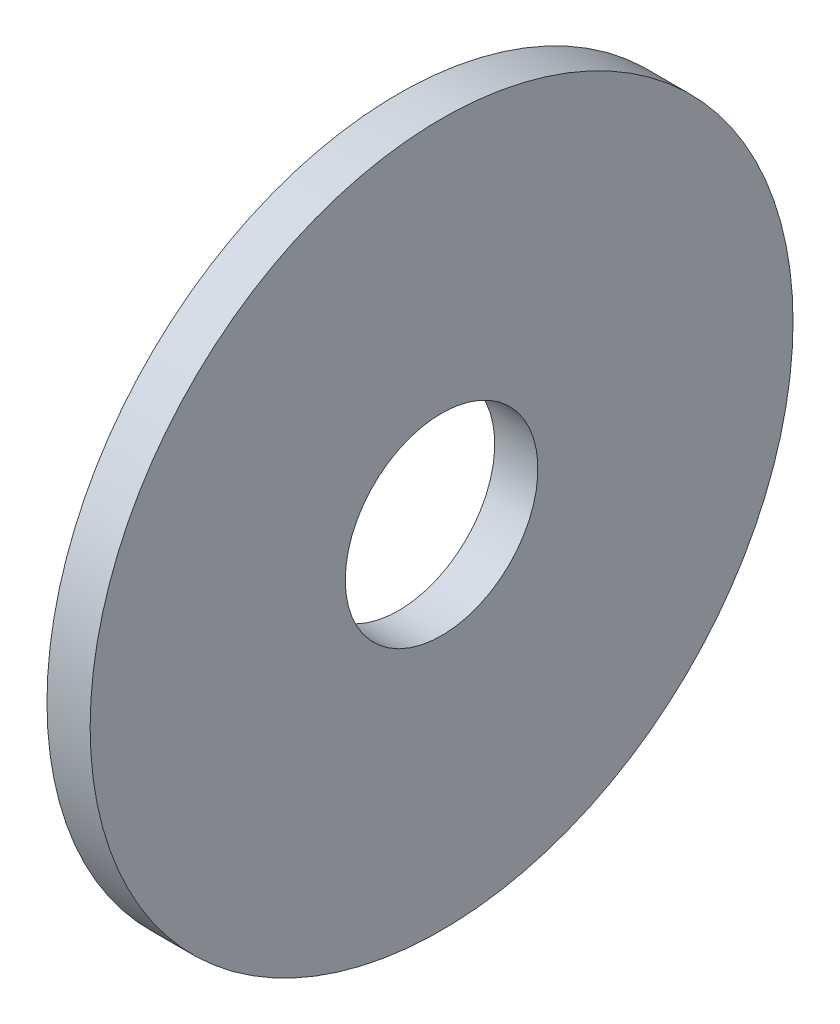
ISO-10303-21;
HEADER;
FILE_DESCRIPTION(('STEP AP214'),'2;1');
FILE_NAME('part.step','',(''),(''),'','','');
FILE_SCHEMA(('AUTOMOTIVE_DESIGN { 1 0 10303 214 1 1 1 1 }'));
ENDSEC;
DATA;
#1=APPLICATION_CONTEXT('core data for automotive mechanical design processes');
#2=APPLICATION_PROTOCOL_DEFINITION('international standard','automotive_design',2000,#1);
#3=PRODUCT_CONTEXT('',#1,'mechanical');
#4=PRODUCT('Part','Part','',(#3));
#5=PRODUCT_RELATED_PRODUCT_CATEGORY('part','',(#4));
#6=PRODUCT_DEFINITION_FORMATION('','',#4);
#7=PRODUCT_DEFINITION_CONTEXT('part definition',#1,'design');
#8=PRODUCT_DEFINITION('design','',#6,#7);
#9=PRODUCT_DEFINITION_SHAPE('','',#8);
#10=(LENGTH_UNIT() NAMED_UNIT(*) SI_UNIT(.MILLI.,.METRE.));
#11=(NAMED_UNIT(*) PLANE_ANGLE_UNIT() SI_UNIT($,.RADIAN.));
#12=(NAMED_UNIT(*) SI_UNIT($,.STERADIAN.) SOLID_ANGLE_UNIT());
#13=UNCERTAINTY_MEASURE_WITH_UNIT(LENGTH_MEASURE(1.E-05),#10,'distance_accuracy_value','');
#14=(GEOMETRIC_REPRESENTATION_CONTEXT(3) GLOBAL_UNCERTAINTY_ASSIGNED_CONTEXT((#13)) GLOBAL_UNIT_ASSIGNED_CONTEXT((#10,
#11,#12)) REPRESENTATION_CONTEXT('',''));
#15=CARTESIAN_POINT('',(0.,0.,0.));
#16=DIRECTION('',(0.,0.,1.));
#17=DIRECTION('',(1.,0.,0.));
#18=AXIS2_PLACEMENT_3D('',#15,#16,#17);
#19=CARTESIAN_POINT('',(-34.9249999999999,0.,0.));
#20=DIRECTION('',(-1.,0.,0.));
#21=DIRECTION('',(0.,0.,1.));
#22=AXIS2_PLACEMENT_3D('',#19,#20,#21);
#23=CYLINDRICAL_SURFACE('',#22,13.4874);
#24=CARTESIAN_POINT('',(0.,0.,0.));
#25=DIRECTION('',(-1.,0.,0.));
#26=DIRECTION('',(0.,0.,1.));
#27=AXIS2_PLACEMENT_3D('',#24,#25,#26);
#28=CIRCLE('',#27,13.4874);
#29=CARTESIAN_POINT('',(0.,0.,13.4874));
#30=VERTEX_POINT('',#29);
#31=EDGE_CURVE('E10',#30,#30,#28,.T.);
#32=ORIENTED_EDGE('',*,*,#31,.F.);
#33=EDGE_LOOP('',(#32));
#34=FACE_BOUND('',#33,.T.);
#35=CARTESIAN_POINT('',(-6.0452,0.,0.));
#36=DIRECTION('',(-1.,0.,0.));
#37=DIRECTION('',(0.,0.,1.));
#38=AXIS2_PLACEMENT_3D('',#35,#36,#37);
#39=CIRCLE('',#38,13.4874);
#40=CARTESIAN_POINT('',(-6.0452,0.,13.4874));
#41=VERTEX_POINT('',#40);
#42=EDGE_CURVE('E44',#41,#41,#39,.T.);
#43=ORIENTED_EDGE('',*,*,#42,.T.);
#44=EDGE_LOOP('',(#43));
#45=FACE_BOUND('',#44,.T.);
#46=ADVANCED_FACE('F30',(#34,#45),#23,.F.);
#47=CARTESIAN_POINT('',(0.,13.4874,0.));
#48=DIRECTION('',(-1.,0.,0.));
#49=DIRECTION('',(0.,0.,1.));
#50=AXIS2_PLACEMENT_3D('',#47,#48,#49);
#51=PLANE('',#50);
#52=CARTESIAN_POINT('',(0.,0.,0.));
#53=DIRECTION('',(-1.,0.,0.));
#54=DIRECTION('',(0.,0.,1.));
#55=AXIS2_PLACEMENT_3D('',#52,#53,#54);
#56=CIRCLE('',#55,49.2125);
#57=CARTESIAN_POINT('',(0.,0.,49.2125));
#58=VERTEX_POINT('',#57);
#59=EDGE_CURVE('E36',#58,#58,#56,.T.);
#60=ORIENTED_EDGE('',*,*,#59,.F.);
#61=EDGE_LOOP('',(#60));
#62=FACE_BOUND('',#61,.T.);
#63=ORIENTED_EDGE('',*,*,#31,.T.);
#64=EDGE_LOOP('',(#63));
#65=FACE_BOUND('',#64,.T.);
#66=ADVANCED_FACE('F59',(#62,#65),#51,.F.);
#67=CARTESIAN_POINT('',(-34.9249999999999,0.,0.));
#68=DIRECTION('',(-1.,0.,0.));
#69=DIRECTION('',(0.,0.,1.));
#70=AXIS2_PLACEMENT_3D('',#67,#68,#69);
#71=CYLINDRICAL_SURFACE('',#70,49.2125);
#72=CARTESIAN_POINT('',(-6.0452,0.,0.));
#73=DIRECTION('',(-1.,0.,0.));
#74=DIRECTION('',(0.,0.,1.));
#75=AXIS2_PLACEMENT_3D('',#72,#73,#74);
#76=CIRCLE('',#75,49.2125);
#77=CARTESIAN_POINT('',(-6.0452,0.,49.2125));
#78=VERTEX_POINT('',#77);
#79=EDGE_CURVE('E40',#78,#78,#76,.T.);
#80=ORIENTED_EDGE('',*,*,#79,.F.);
#81=EDGE_LOOP('',(#80));
#82=FACE_BOUND('',#81,.T.);
#83=ORIENTED_EDGE('',*,*,#59,.T.);
#84=EDGE_LOOP('',(#83));
#85=FACE_BOUND('',#84,.T.);
#86=ADVANCED_FACE('F54',(#82,#85),#71,.T.);
#87=CARTESIAN_POINT('',(-6.0452,49.2125,0.));
#88=DIRECTION('',(1.,0.,0.));
#89=DIRECTION('',(0.,0.,-1.));
#90=AXIS2_PLACEMENT_3D('',#87,#88,#89);
#91=PLANE('',#90);
#92=ORIENTED_EDGE('',*,*,#42,.F.);
#93=EDGE_LOOP('',(#92));
#94=FACE_BOUND('',#93,.T.);
#95=ORIENTED_EDGE('',*,*,#79,.T.);
#96=EDGE_LOOP('',(#95));
#97=FACE_BOUND('',#96,.T.);
#98=ADVANCED_FACE('F51',(#94,#97),#91,.F.);
#99=CLOSED_SHELL('',(#46,#66,#86,#98));
#100=MANIFOLD_SOLID_BREP('B2',#99);
#101=ADVANCED_BREP_SHAPE_REPRESENTATION('',(#18,#100),#14);
#102=SHAPE_DEFINITION_REPRESENTATION(#9,#101);
ENDSEC;
END-ISO-10303-21;
